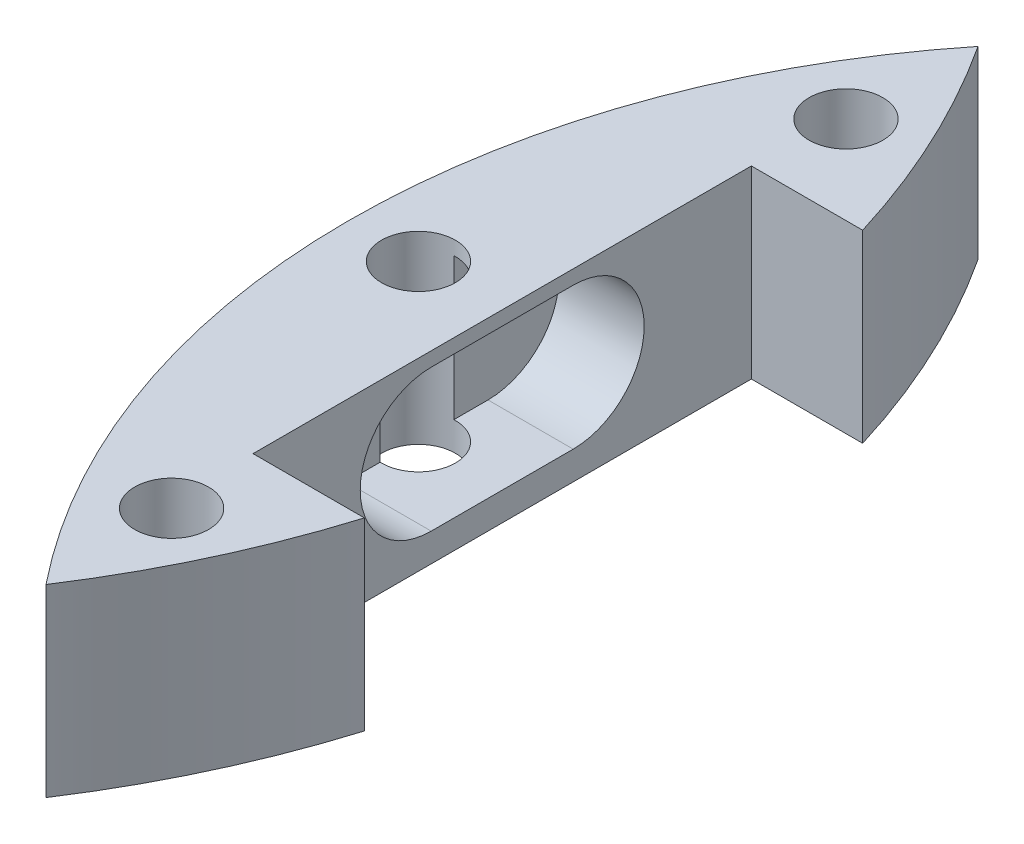
ISO-10303-21;
HEADER;
FILE_DESCRIPTION(('STEP AP214'),'2;1');
FILE_NAME('part.step','',(''),(''),'','','');
FILE_SCHEMA(('AUTOMOTIVE_DESIGN { 1 0 10303 214 1 1 1 1 }'));
ENDSEC;
DATA;
#1=APPLICATION_CONTEXT('core data for automotive mechanical design processes');
#2=APPLICATION_PROTOCOL_DEFINITION('international standard','automotive_design',2000,#1);
#3=PRODUCT_CONTEXT('',#1,'mechanical');
#4=PRODUCT('Part','Part','',(#3));
#5=PRODUCT_RELATED_PRODUCT_CATEGORY('part','',(#4));
#6=PRODUCT_DEFINITION_FORMATION('','',#4);
#7=PRODUCT_DEFINITION_CONTEXT('part definition',#1,'design');
#8=PRODUCT_DEFINITION('design','',#6,#7);
#9=PRODUCT_DEFINITION_SHAPE('','',#8);
#10=(LENGTH_UNIT() NAMED_UNIT(*) SI_UNIT(.MILLI.,.METRE.));
#11=(NAMED_UNIT(*) PLANE_ANGLE_UNIT() SI_UNIT($,.RADIAN.));
#12=(NAMED_UNIT(*) SI_UNIT($,.STERADIAN.) SOLID_ANGLE_UNIT());
#13=UNCERTAINTY_MEASURE_WITH_UNIT(LENGTH_MEASURE(1.E-05),#10,'distance_accuracy_value','');
#14=(GEOMETRIC_REPRESENTATION_CONTEXT(3) GLOBAL_UNCERTAINTY_ASSIGNED_CONTEXT((#13)) GLOBAL_UNIT_ASSIGNED_CONTEXT((#10,
#11,#12)) REPRESENTATION_CONTEXT('',''));
#15=CARTESIAN_POINT('',(0.,0.,0.));
#16=DIRECTION('',(0.,0.,1.));
#17=DIRECTION('',(1.,0.,0.));
#18=AXIS2_PLACEMENT_3D('',#15,#16,#17);
#19=CARTESIAN_POINT('',(-47.5,13.,0.));
#20=DIRECTION('',(0.,-1.,0.));
#21=DIRECTION('',(0.,0.,-1.));
#22=AXIS2_PLACEMENT_3D('',#19,#20,#21);
#23=CYLINDRICAL_SURFACE('',#22,2.6);
#24=CARTESIAN_POINT('',(-47.5,13.,0.));
#25=DIRECTION('',(0.,1.,0.));
#26=DIRECTION('',(0.,0.,1.));
#27=AXIS2_PLACEMENT_3D('',#24,#25,#26);
#28=CIRCLE('',#27,2.6);
#29=CARTESIAN_POINT('',(-47.5,13.,2.6));
#30=VERTEX_POINT('',#29);
#31=EDGE_CURVE('E195',#30,#30,#28,.T.);
#32=ORIENTED_EDGE('',*,*,#31,.T.);
#33=EDGE_LOOP('',(#32));
#34=FACE_BOUND('',#33,.T.);
#35=CARTESIAN_POINT('',(-47.5,0.,0.));
#36=DIRECTION('',(0.,1.,0.));
#37=DIRECTION('',(0.,0.,1.));
#38=AXIS2_PLACEMENT_3D('',#35,#36,#37);
#39=CIRCLE('',#38,2.6);
#40=CARTESIAN_POINT('',(-47.5,0.,2.6));
#41=VERTEX_POINT('',#40);
#42=EDGE_CURVE('E214',#41,#41,#39,.T.);
#43=ORIENTED_EDGE('',*,*,#42,.F.);
#44=EDGE_LOOP('',(#43));
#45=FACE_BOUND('',#44,.T.);
#46=CARTESIAN_POINT('',(-47.5,12.,0.));
#47=DIRECTION('',(0.,1.,0.));
#48=DIRECTION('',(0.,0.,1.));
#49=AXIS2_PLACEMENT_3D('',#46,#47,#48);
#50=CIRCLE('',#49,2.6);
#51=CARTESIAN_POINT('',(-47.6,12.,2.59807621135331));
#52=VERTEX_POINT('',#51);
#53=CARTESIAN_POINT('',(-47.6,12.,-2.59807621135331));
#54=VERTEX_POINT('',#53);
#55=EDGE_CURVE('E169',#52,#54,#50,.T.);
#56=ORIENTED_EDGE('',*,*,#55,.F.);
#57=DIRECTION('',(0.,-1.,0.));
#58=VECTOR('',#57,1.);
#59=CARTESIAN_POINT('',(-47.6,13.,2.59807621135331));
#60=LINE('',#59,#58);
#61=CARTESIAN_POINT('',(-47.6,2.,2.59807621135331));
#62=VERTEX_POINT('',#61);
#63=EDGE_CURVE('E11',#52,#62,#60,.T.);
#64=ORIENTED_EDGE('',*,*,#63,.T.);
#65=CARTESIAN_POINT('',(-47.5,2.,0.));
#66=DIRECTION('',(0.,-1.,0.));
#67=DIRECTION('',(0.,0.,-1.));
#68=AXIS2_PLACEMENT_3D('',#65,#66,#67);
#69=CIRCLE('',#68,2.6);
#70=CARTESIAN_POINT('',(-47.6,2.,-2.59807621135331));
#71=VERTEX_POINT('',#70);
#72=EDGE_CURVE('E141',#71,#62,#69,.T.);
#73=ORIENTED_EDGE('',*,*,#72,.F.);
#74=DIRECTION('',(0.,-1.,0.));
#75=VECTOR('',#74,1.);
#76=CARTESIAN_POINT('',(-47.6,13.,-2.59807621135331));
#77=LINE('',#76,#75);
#78=EDGE_CURVE('E46',#71,#54,#77,.F.);
#79=ORIENTED_EDGE('',*,*,#78,.T.);
#80=EDGE_LOOP('',(#56,#64,#73,#79));
#81=FACE_BOUND('',#80,.T.);
#82=ADVANCED_FACE('F38',(#34,#45,#81),#23,.F.);
#83=CARTESIAN_POINT('',(0.,13.,-17.55));
#84=DIRECTION('',(0.,0.,1.));
#85=DIRECTION('',(1.,0.,0.));
#86=AXIS2_PLACEMENT_3D('',#83,#84,#85);
#87=PLANE('',#86);
#88=DIRECTION('',(-1.,0.,0.));
#89=VECTOR('',#88,1.);
#90=CARTESIAN_POINT('',(0.,0.,-17.55));
#91=LINE('',#90,#89);
#92=CARTESIAN_POINT('',(-33.7602753147711,0.,-17.55));
#93=VERTEX_POINT('',#92);
#94=CARTESIAN_POINT('',(-41.6,0.,-17.55));
#95=VERTEX_POINT('',#94);
#96=EDGE_CURVE('E178',#93,#95,#91,.T.);
#97=ORIENTED_EDGE('',*,*,#96,.F.);
#98=DIRECTION('',(0.,-1.,0.));
#99=VECTOR('',#98,1.);
#100=CARTESIAN_POINT('',(-33.7602753147711,13.,-17.55));
#101=LINE('',#100,#99);
#102=CARTESIAN_POINT('',(-33.7602753147711,13.,-17.55));
#103=VERTEX_POINT('',#102);
#104=EDGE_CURVE('E227',#103,#93,#101,.T.);
#105=ORIENTED_EDGE('',*,*,#104,.F.);
#106=DIRECTION('',(-1.,0.,0.));
#107=VECTOR('',#106,1.);
#108=CARTESIAN_POINT('',(0.,13.,-17.55));
#109=LINE('',#108,#107);
#110=CARTESIAN_POINT('',(-41.6,13.,-17.55));
#111=VERTEX_POINT('',#110);
#112=EDGE_CURVE('E181',#103,#111,#109,.T.);
#113=ORIENTED_EDGE('',*,*,#112,.T.);
#114=DIRECTION('',(0.,1.,0.));
#115=VECTOR('',#114,1.);
#116=CARTESIAN_POINT('',(-41.6,-10.,-17.55));
#117=LINE('',#116,#115);
#118=EDGE_CURVE('E174',#95,#111,#117,.T.);
#119=ORIENTED_EDGE('',*,*,#118,.F.);
#120=EDGE_LOOP('',(#97,#105,#113,#119));
#121=FACE_BOUND('',#120,.T.);
#122=ADVANCED_FACE('F40',(#121),#87,.T.);
#123=CARTESIAN_POINT('',(-91.1362066797607,13.,-1.28369537222284E-13));
#124=DIRECTION('',(0.,-1.,0.));
#125=DIRECTION('',(0.,0.,-1.));
#126=AXIS2_PLACEMENT_3D('',#123,#124,#125);
#127=CYLINDRICAL_SURFACE('',#126,60.);
#128=CARTESIAN_POINT('',(-91.1362066797607,0.,-1.28369537222284E-13));
#129=DIRECTION('',(0.,1.,0.));
#130=DIRECTION('',(0.,0.,1.));
#131=AXIS2_PLACEMENT_3D('',#128,#129,#130);
#132=CIRCLE('',#131,60.);
#133=CARTESIAN_POINT('',(-40.9102536721667,0.,-32.8230657385773));
#134=VERTEX_POINT('',#133);
#135=EDGE_CURVE('E203',#93,#134,#132,.T.);
#136=ORIENTED_EDGE('',*,*,#135,.T.);
#137=DIRECTION('',(0.,-1.,0.));
#138=VECTOR('',#137,1.);
#139=CARTESIAN_POINT('',(-40.9102536721667,13.,-32.8230657385773));
#140=LINE('',#139,#138);
#141=CARTESIAN_POINT('',(-40.9102536721667,13.,-32.8230657385773));
#142=VERTEX_POINT('',#141);
#143=EDGE_CURVE('E224',#142,#134,#140,.T.);
#144=ORIENTED_EDGE('',*,*,#143,.F.);
#145=CARTESIAN_POINT('',(-91.1362066797607,13.,-1.28369537222284E-13));
#146=DIRECTION('',(0.,1.,0.));
#147=DIRECTION('',(0.,0.,1.));
#148=AXIS2_PLACEMENT_3D('',#145,#146,#147);
#149=CIRCLE('',#148,60.);
#150=EDGE_CURVE('E183',#103,#142,#149,.T.);
#151=ORIENTED_EDGE('',*,*,#150,.F.);
#152=ORIENTED_EDGE('',*,*,#104,.T.);
#153=EDGE_LOOP('',(#136,#144,#151,#152));
#154=FACE_BOUND('',#153,.T.);
#155=ADVANCED_FACE('F273',(#154),#127,.T.);
#156=CARTESIAN_POINT('',(0.,13.,0.));
#157=DIRECTION('',(0.,-1.,0.));
#158=DIRECTION('',(0.,0.,-1.));
#159=AXIS2_PLACEMENT_3D('',#156,#157,#158);
#160=CYLINDRICAL_SURFACE('',#159,52.45);
#161=CARTESIAN_POINT('',(0.,0.,0.));
#162=DIRECTION('',(0.,1.,0.));
#163=DIRECTION('',(0.,0.,1.));
#164=AXIS2_PLACEMENT_3D('',#161,#162,#163);
#165=CIRCLE('',#164,52.45);
#166=CARTESIAN_POINT('',(-40.9102536721668,0.,32.8230657385772));
#167=VERTEX_POINT('',#166);
#168=EDGE_CURVE('E205',#134,#167,#165,.T.);
#169=ORIENTED_EDGE('',*,*,#168,.T.);
#170=DIRECTION('',(0.,-1.,0.));
#171=VECTOR('',#170,1.);
#172=CARTESIAN_POINT('',(-40.9102536721668,13.,32.8230657385772));
#173=LINE('',#172,#171);
#174=CARTESIAN_POINT('',(-40.9102536721668,13.,32.8230657385772));
#175=VERTEX_POINT('',#174);
#176=EDGE_CURVE('E221',#175,#167,#173,.T.);
#177=ORIENTED_EDGE('',*,*,#176,.F.);
#178=CARTESIAN_POINT('',(0.,13.,0.));
#179=DIRECTION('',(0.,1.,0.));
#180=DIRECTION('',(0.,0.,1.));
#181=AXIS2_PLACEMENT_3D('',#178,#179,#180);
#182=CIRCLE('',#181,52.45);
#183=EDGE_CURVE('E186',#142,#175,#182,.T.);
#184=ORIENTED_EDGE('',*,*,#183,.F.);
#185=ORIENTED_EDGE('',*,*,#143,.T.);
#186=EDGE_LOOP('',(#169,#177,#184,#185));
#187=FACE_BOUND('',#186,.T.);
#188=ADVANCED_FACE('F277',(#187),#160,.T.);
#189=CARTESIAN_POINT('',(-91.1362066797607,13.,-1.28369537222284E-13));
#190=DIRECTION('',(0.,-1.,0.));
#191=DIRECTION('',(0.,0.,-1.));
#192=AXIS2_PLACEMENT_3D('',#189,#190,#191);
#193=CYLINDRICAL_SURFACE('',#192,60.);
#194=CARTESIAN_POINT('',(-91.1362066797607,0.,-1.28369537222284E-13));
#195=DIRECTION('',(0.,1.,0.));
#196=DIRECTION('',(0.,0.,1.));
#197=AXIS2_PLACEMENT_3D('',#194,#195,#196);
#198=CIRCLE('',#197,60.);
#199=CARTESIAN_POINT('',(-33.7602753147711,0.,17.55));
#200=VERTEX_POINT('',#199);
#201=EDGE_CURVE('E207',#167,#200,#198,.T.);
#202=ORIENTED_EDGE('',*,*,#201,.T.);
#203=DIRECTION('',(0.,-1.,0.));
#204=VECTOR('',#203,1.);
#205=CARTESIAN_POINT('',(-33.7602753147711,13.,17.55));
#206=LINE('',#205,#204);
#207=CARTESIAN_POINT('',(-33.7602753147711,13.,17.55));
#208=VERTEX_POINT('',#207);
#209=EDGE_CURVE('E201',#208,#200,#206,.T.);
#210=ORIENTED_EDGE('',*,*,#209,.F.);
#211=CARTESIAN_POINT('',(-91.1362066797607,13.,-1.28369537222284E-13));
#212=DIRECTION('',(0.,1.,0.));
#213=DIRECTION('',(0.,0.,1.));
#214=AXIS2_PLACEMENT_3D('',#211,#212,#213);
#215=CIRCLE('',#214,60.);
#216=EDGE_CURVE('E188',#175,#208,#215,.T.);
#217=ORIENTED_EDGE('',*,*,#216,.F.);
#218=ORIENTED_EDGE('',*,*,#176,.T.);
#219=EDGE_LOOP('',(#202,#210,#217,#218));
#220=FACE_BOUND('',#219,.T.);
#221=ADVANCED_FACE('F279',(#220),#193,.T.);
#222=CARTESIAN_POINT('',(0.,13.,17.55));
#223=DIRECTION('',(0.,0.,1.));
#224=DIRECTION('',(1.,0.,0.));
#225=AXIS2_PLACEMENT_3D('',#222,#223,#224);
#226=PLANE('',#225);
#227=DIRECTION('',(-1.,0.,0.));
#228=VECTOR('',#227,1.);
#229=CARTESIAN_POINT('',(0.,0.,17.55));
#230=LINE('',#229,#228);
#231=CARTESIAN_POINT('',(-41.6,0.,17.55));
#232=VERTEX_POINT('',#231);
#233=EDGE_CURVE('E209',#200,#232,#230,.T.);
#234=ORIENTED_EDGE('',*,*,#233,.T.);
#235=DIRECTION('',(0.,1.,0.));
#236=VECTOR('',#235,1.);
#237=CARTESIAN_POINT('',(-41.6,-10.,17.55));
#238=LINE('',#237,#236);
#239=CARTESIAN_POINT('',(-41.6,13.,17.55));
#240=VERTEX_POINT('',#239);
#241=EDGE_CURVE('E175',#232,#240,#238,.T.);
#242=ORIENTED_EDGE('',*,*,#241,.T.);
#243=DIRECTION('',(-1.,0.,0.));
#244=VECTOR('',#243,1.);
#245=CARTESIAN_POINT('',(0.,13.,17.55));
#246=LINE('',#245,#244);
#247=EDGE_CURVE('E190',#208,#240,#246,.T.);
#248=ORIENTED_EDGE('',*,*,#247,.F.);
#249=ORIENTED_EDGE('',*,*,#209,.T.);
#250=EDGE_LOOP('',(#234,#242,#248,#249));
#251=FACE_BOUND('',#250,.T.);
#252=ADVANCED_FACE('F263',(#251),#226,.F.);
#253=CARTESIAN_POINT('',(-41.1362066797607,13.,-23.7500000000003));
#254=DIRECTION('',(0.,-1.,0.));
#255=DIRECTION('',(0.,0.,-1.));
#256=AXIS2_PLACEMENT_3D('',#253,#254,#255);
#257=CYLINDRICAL_SURFACE('',#256,2.60000000000001);
#258=CARTESIAN_POINT('',(-41.1362066797607,13.,-23.7500000000003));
#259=DIRECTION('',(0.,1.,0.));
#260=DIRECTION('',(0.,0.,1.));
#261=AXIS2_PLACEMENT_3D('',#258,#259,#260);
#262=CIRCLE('',#261,2.60000000000001);
#263=CARTESIAN_POINT('',(-41.1362066797607,13.,-26.3500000000003));
#264=VERTEX_POINT('',#263);
#265=EDGE_CURVE('E192',#264,#264,#262,.T.);
#266=CARTESIAN_POINT('',(-41.1362066797607,0.,-23.7500000000003));
#267=DIRECTION('',(0.,1.,0.));
#268=DIRECTION('',(0.,0.,1.));
#269=AXIS2_PLACEMENT_3D('',#266,#267,#268);
#270=CIRCLE('',#269,2.60000000000001);
#271=CARTESIAN_POINT('',(-41.1362066797607,0.,-26.3500000000003));
#272=VERTEX_POINT('',#271);
#273=EDGE_CURVE('E211',#272,#272,#270,.T.);
#274=CARTESIAN_POINT('',(-41.1362066797607,13.,-26.3500000000003));
#275=CARTESIAN_POINT('',(-41.1362066797607,12.8645833333333,-26.3500000000003));
#276=CARTESIAN_POINT('',(-41.1362066797607,12.7291666666667,-26.3500000000003));
#277=CARTESIAN_POINT('',(-41.1362066797607,12.4583333333333,-26.3500000000003));
#278=CARTESIAN_POINT('',(-41.1362066797607,12.3229166666667,-26.3500000000003));
#279=CARTESIAN_POINT('',(-41.1362066797607,12.0520833333333,-26.3500000000003));
#280=CARTESIAN_POINT('',(-41.1362066797607,11.9166666666667,-26.3500000000003));
#281=CARTESIAN_POINT('',(-41.1362066797607,11.6458333333333,-26.3500000000003));
#282=CARTESIAN_POINT('',(-41.1362066797607,11.5104166666667,-26.3500000000003));
#283=CARTESIAN_POINT('',(-41.1362066797607,11.2395833333333,-26.3500000000003));
#284=CARTESIAN_POINT('',(-41.1362066797607,11.1041666666667,-26.3500000000003));
#285=CARTESIAN_POINT('',(-41.1362066797607,10.8333333333333,-26.3500000000003));
#286=CARTESIAN_POINT('',(-41.1362066797607,10.6979166666667,-26.3500000000003));
#287=CARTESIAN_POINT('',(-41.1362066797607,10.4270833333333,-26.3500000000003));
#288=CARTESIAN_POINT('',(-41.1362066797607,10.2916666666667,-26.3500000000003));
#289=CARTESIAN_POINT('',(-41.1362066797607,10.0208333333333,-26.3500000000003));
#290=CARTESIAN_POINT('',(-41.1362066797607,9.88541666666667,-26.3500000000003));
#291=CARTESIAN_POINT('',(-41.1362066797607,9.61458333333333,-26.3500000000003));
#292=CARTESIAN_POINT('',(-41.1362066797607,9.47916666666667,-26.3500000000003));
#293=CARTESIAN_POINT('',(-41.1362066797607,9.20833333333333,-26.3500000000003));
#294=CARTESIAN_POINT('',(-41.1362066797607,9.07291666666667,-26.3500000000003));
#295=CARTESIAN_POINT('',(-41.1362066797607,8.80208333333333,-26.3500000000003));
#296=CARTESIAN_POINT('',(-41.1362066797607,8.66666666666667,-26.3500000000003));
#297=CARTESIAN_POINT('',(-41.1362066797607,8.39583333333333,-26.3500000000003));
#298=CARTESIAN_POINT('',(-41.1362066797607,8.26041666666667,-26.3500000000003));
#299=CARTESIAN_POINT('',(-41.1362066797607,7.98958333333333,-26.3500000000003));
#300=CARTESIAN_POINT('',(-41.1362066797607,7.85416666666667,-26.3500000000003));
#301=CARTESIAN_POINT('',(-41.1362066797607,7.58333333333333,-26.3500000000003));
#302=CARTESIAN_POINT('',(-41.1362066797607,7.44791666666667,-26.3500000000003));
#303=CARTESIAN_POINT('',(-41.1362066797607,7.17708333333333,-26.3500000000003));
#304=CARTESIAN_POINT('',(-41.1362066797607,7.04166666666667,-26.3500000000003));
#305=CARTESIAN_POINT('',(-41.1362066797607,6.77083333333333,-26.3500000000003));
#306=CARTESIAN_POINT('',(-41.1362066797607,6.63541666666667,-26.3500000000003));
#307=CARTESIAN_POINT('',(-41.1362066797607,6.36458333333333,-26.3500000000003));
#308=CARTESIAN_POINT('',(-41.1362066797607,6.22916666666667,-26.3500000000003));
#309=CARTESIAN_POINT('',(-41.1362066797607,5.95833333333333,-26.3500000000003));
#310=CARTESIAN_POINT('',(-41.1362066797607,5.82291666666667,-26.3500000000003));
#311=CARTESIAN_POINT('',(-41.1362066797607,5.55208333333333,-26.3500000000003));
#312=CARTESIAN_POINT('',(-41.1362066797607,5.41666666666667,-26.3500000000003));
#313=CARTESIAN_POINT('',(-41.1362066797607,5.14583333333333,-26.3500000000003));
#314=CARTESIAN_POINT('',(-41.1362066797607,5.01041666666667,-26.3500000000003));
#315=CARTESIAN_POINT('',(-41.1362066797607,4.73958333333333,-26.3500000000003));
#316=CARTESIAN_POINT('',(-41.1362066797607,4.60416666666667,-26.3500000000003));
#317=CARTESIAN_POINT('',(-41.1362066797607,4.33333333333333,-26.3500000000003));
#318=CARTESIAN_POINT('',(-41.1362066797607,4.19791666666667,-26.3500000000003));
#319=CARTESIAN_POINT('',(-41.1362066797607,3.92708333333333,-26.3500000000003));
#320=CARTESIAN_POINT('',(-41.1362066797607,3.79166666666667,-26.3500000000003));
#321=CARTESIAN_POINT('',(-41.1362066797607,3.52083333333333,-26.3500000000003));
#322=CARTESIAN_POINT('',(-41.1362066797607,3.38541666666667,-26.3500000000003));
#323=CARTESIAN_POINT('',(-41.1362066797607,3.11458333333333,-26.3500000000003));
#324=CARTESIAN_POINT('',(-41.1362066797607,2.97916666666667,-26.3500000000003));
#325=CARTESIAN_POINT('',(-41.1362066797607,2.70833333333333,-26.3500000000003));
#326=CARTESIAN_POINT('',(-41.1362066797607,2.57291666666667,-26.3500000000003));
#327=CARTESIAN_POINT('',(-41.1362066797607,2.30208333333333,-26.3500000000003));
#328=CARTESIAN_POINT('',(-41.1362066797607,2.16666666666667,-26.3500000000003));
#329=CARTESIAN_POINT('',(-41.1362066797607,1.89583333333333,-26.3500000000003));
#330=CARTESIAN_POINT('',(-41.1362066797607,1.76041666666667,-26.3500000000003));
#331=CARTESIAN_POINT('',(-41.1362066797607,1.48958333333333,-26.3500000000003));
#332=CARTESIAN_POINT('',(-41.1362066797607,1.35416666666667,-26.3500000000003));
#333=CARTESIAN_POINT('',(-41.1362066797607,1.08333333333333,-26.3500000000003));
#334=CARTESIAN_POINT('',(-41.1362066797607,0.947916666666667,-26.3500000000003));
#335=CARTESIAN_POINT('',(-41.1362066797607,0.677083333333334,-26.3500000000003));
#336=CARTESIAN_POINT('',(-41.1362066797607,0.541666666666667,-26.3500000000003));
#337=CARTESIAN_POINT('',(-41.1362066797607,0.270833333333334,-26.3500000000003));
#338=CARTESIAN_POINT('',(-41.1362066797607,0.135416666666667,-26.3500000000003));
#339=CARTESIAN_POINT('',(-41.1362066797607,0.,-26.3500000000003));
#340=B_SPLINE_CURVE_WITH_KNOTS('',3,(#274,#275,#276,#277,#278,#279,#280,#281,#282,#283,#284,
#285,#286,#287,#288,#289,#290,#291,#292,#293,#294,#295,#296,#297,#298,#299,#300,#301,#302,#303,
#304,#305,#306,#307,#308,#309,#310,#311,#312,#313,#314,#315,#316,#317,#318,#319,#320,#321,#322,
#323,#324,#325,#326,#327,#328,#329,#330,#331,#332,#333,#334,#335,#336,#337,#338,#339),
.UNSPECIFIED.,.F.,.F.,(4,2,2,2,2,2,2,2,2,2,2,2,2,2,2,2,2,2,2,2,2,2,2,2,2,2,2,2,2,2,2,2,4),(0.,
0.406249999999999,0.812499999999999,1.21875,1.625,2.03125,2.4375,2.84375,3.25,3.65625,4.0625,
4.46875,4.875,5.28125,5.6875,6.09375,6.5,6.90625,7.3125,7.71875,8.125,8.53125,8.9375,9.34375,
9.75,10.15625,10.5625,10.96875,11.375,11.78125,12.1875,12.59375,13.),.UNSPECIFIED.);
#341=EDGE_CURVE('BSEAM287',#264,#272,#340,.T.);
#342=ORIENTED_EDGE('',*,*,#265,.T.);
#343=ORIENTED_EDGE('',*,*,#273,.F.);
#344=ORIENTED_EDGE('',*,*,#341,.T.);
#345=ORIENTED_EDGE('',*,*,#341,.F.);
#346=EDGE_LOOP('',(#342,#344,#343,#345));
#347=FACE_BOUND('',#346,.T.);
#348=ADVANCED_FACE('F287',(#347),#257,.F.);
#349=CARTESIAN_POINT('',(-41.1362066797608,13.,23.7500000000001));
#350=DIRECTION('',(0.,-1.,0.));
#351=DIRECTION('',(0.,0.,-1.));
#352=AXIS2_PLACEMENT_3D('',#349,#350,#351);
#353=CYLINDRICAL_SURFACE('',#352,2.59999999999999);
#354=CARTESIAN_POINT('',(-41.1362066797608,13.,23.7500000000001));
#355=DIRECTION('',(0.,1.,0.));
#356=DIRECTION('',(0.,0.,1.));
#357=AXIS2_PLACEMENT_3D('',#354,#355,#356);
#358=CIRCLE('',#357,2.59999999999999);
#359=CARTESIAN_POINT('',(-41.1362066797608,13.,21.1500000000001));
#360=VERTEX_POINT('',#359);
#361=EDGE_CURVE('E198',#360,#360,#358,.T.);
#362=CARTESIAN_POINT('',(-41.1362066797608,0.,23.7500000000001));
#363=DIRECTION('',(0.,1.,0.));
#364=DIRECTION('',(0.,0.,1.));
#365=AXIS2_PLACEMENT_3D('',#362,#363,#364);
#366=CIRCLE('',#365,2.59999999999999);
#367=CARTESIAN_POINT('',(-41.1362066797608,0.,21.1500000000001));
#368=VERTEX_POINT('',#367);
#369=EDGE_CURVE('E184',#368,#368,#366,.T.);
#370=CARTESIAN_POINT('',(-41.1362066797608,13.,21.1500000000001));
#371=CARTESIAN_POINT('',(-41.1362066797608,12.8645833333333,21.1500000000001));
#372=CARTESIAN_POINT('',(-41.1362066797608,12.7291666666667,21.1500000000001));
#373=CARTESIAN_POINT('',(-41.1362066797608,12.4583333333333,21.1500000000001));
#374=CARTESIAN_POINT('',(-41.1362066797608,12.3229166666667,21.1500000000001));
#375=CARTESIAN_POINT('',(-41.1362066797608,12.0520833333333,21.1500000000001));
#376=CARTESIAN_POINT('',(-41.1362066797608,11.9166666666667,21.1500000000001));
#377=CARTESIAN_POINT('',(-41.1362066797608,11.6458333333333,21.1500000000001));
#378=CARTESIAN_POINT('',(-41.1362066797608,11.5104166666667,21.1500000000001));
#379=CARTESIAN_POINT('',(-41.1362066797608,11.2395833333333,21.1500000000001));
#380=CARTESIAN_POINT('',(-41.1362066797608,11.1041666666667,21.1500000000001));
#381=CARTESIAN_POINT('',(-41.1362066797608,10.8333333333333,21.1500000000001));
#382=CARTESIAN_POINT('',(-41.1362066797608,10.6979166666667,21.1500000000001));
#383=CARTESIAN_POINT('',(-41.1362066797608,10.4270833333333,21.1500000000001));
#384=CARTESIAN_POINT('',(-41.1362066797608,10.2916666666667,21.1500000000001));
#385=CARTESIAN_POINT('',(-41.1362066797608,10.0208333333333,21.1500000000001));
#386=CARTESIAN_POINT('',(-41.1362066797608,9.88541666666667,21.1500000000001));
#387=CARTESIAN_POINT('',(-41.1362066797608,9.61458333333333,21.1500000000001));
#388=CARTESIAN_POINT('',(-41.1362066797608,9.47916666666667,21.1500000000001));
#389=CARTESIAN_POINT('',(-41.1362066797608,9.20833333333333,21.1500000000001));
#390=CARTESIAN_POINT('',(-41.1362066797608,9.07291666666667,21.1500000000001));
#391=CARTESIAN_POINT('',(-41.1362066797608,8.80208333333333,21.1500000000001));
#392=CARTESIAN_POINT('',(-41.1362066797608,8.66666666666667,21.1500000000001));
#393=CARTESIAN_POINT('',(-41.1362066797608,8.39583333333333,21.1500000000001));
#394=CARTESIAN_POINT('',(-41.1362066797608,8.26041666666667,21.1500000000001));
#395=CARTESIAN_POINT('',(-41.1362066797608,7.98958333333333,21.1500000000001));
#396=CARTESIAN_POINT('',(-41.1362066797608,7.85416666666667,21.1500000000001));
#397=CARTESIAN_POINT('',(-41.1362066797608,7.58333333333333,21.1500000000001));
#398=CARTESIAN_POINT('',(-41.1362066797608,7.44791666666667,21.1500000000001));
#399=CARTESIAN_POINT('',(-41.1362066797608,7.17708333333333,21.1500000000001));
#400=CARTESIAN_POINT('',(-41.1362066797608,7.04166666666667,21.1500000000001));
#401=CARTESIAN_POINT('',(-41.1362066797608,6.77083333333333,21.1500000000001));
#402=CARTESIAN_POINT('',(-41.1362066797608,6.63541666666667,21.1500000000001));
#403=CARTESIAN_POINT('',(-41.1362066797608,6.36458333333333,21.1500000000001));
#404=CARTESIAN_POINT('',(-41.1362066797608,6.22916666666667,21.1500000000001));
#405=CARTESIAN_POINT('',(-41.1362066797608,5.95833333333333,21.1500000000001));
#406=CARTESIAN_POINT('',(-41.1362066797608,5.82291666666667,21.1500000000001));
#407=CARTESIAN_POINT('',(-41.1362066797608,5.55208333333333,21.1500000000001));
#408=CARTESIAN_POINT('',(-41.1362066797608,5.41666666666667,21.1500000000001));
#409=CARTESIAN_POINT('',(-41.1362066797608,5.14583333333333,21.1500000000001));
#410=CARTESIAN_POINT('',(-41.1362066797608,5.01041666666667,21.1500000000001));
#411=CARTESIAN_POINT('',(-41.1362066797608,4.73958333333333,21.1500000000001));
#412=CARTESIAN_POINT('',(-41.1362066797608,4.60416666666667,21.1500000000001));
#413=CARTESIAN_POINT('',(-41.1362066797608,4.33333333333333,21.1500000000001));
#414=CARTESIAN_POINT('',(-41.1362066797608,4.19791666666667,21.1500000000001));
#415=CARTESIAN_POINT('',(-41.1362066797608,3.92708333333333,21.1500000000001));
#416=CARTESIAN_POINT('',(-41.1362066797608,3.79166666666667,21.1500000000001));
#417=CARTESIAN_POINT('',(-41.1362066797608,3.52083333333333,21.1500000000001));
#418=CARTESIAN_POINT('',(-41.1362066797608,3.38541666666667,21.1500000000001));
#419=CARTESIAN_POINT('',(-41.1362066797608,3.11458333333333,21.1500000000001));
#420=CARTESIAN_POINT('',(-41.1362066797608,2.97916666666667,21.1500000000001));
#421=CARTESIAN_POINT('',(-41.1362066797608,2.70833333333333,21.1500000000001));
#422=CARTESIAN_POINT('',(-41.1362066797608,2.57291666666667,21.1500000000001));
#423=CARTESIAN_POINT('',(-41.1362066797608,2.30208333333333,21.1500000000001));
#424=CARTESIAN_POINT('',(-41.1362066797608,2.16666666666667,21.1500000000001));
#425=CARTESIAN_POINT('',(-41.1362066797608,1.89583333333333,21.1500000000001));
#426=CARTESIAN_POINT('',(-41.1362066797608,1.76041666666667,21.1500000000001));
#427=CARTESIAN_POINT('',(-41.1362066797608,1.48958333333333,21.1500000000001));
#428=CARTESIAN_POINT('',(-41.1362066797608,1.35416666666667,21.1500000000001));
#429=CARTESIAN_POINT('',(-41.1362066797608,1.08333333333333,21.1500000000001));
#430=CARTESIAN_POINT('',(-41.1362066797608,0.947916666666667,21.1500000000001));
#431=CARTESIAN_POINT('',(-41.1362066797608,0.677083333333334,21.1500000000001));
#432=CARTESIAN_POINT('',(-41.1362066797608,0.541666666666667,21.1500000000001));
#433=CARTESIAN_POINT('',(-41.1362066797608,0.270833333333334,21.1500000000001));
#434=CARTESIAN_POINT('',(-41.1362066797608,0.135416666666667,21.1500000000001));
#435=CARTESIAN_POINT('',(-41.1362066797608,0.,21.1500000000001));
#436=B_SPLINE_CURVE_WITH_KNOTS('',3,(#370,#371,#372,#373,#374,#375,#376,#377,#378,#379,#380,
#381,#382,#383,#384,#385,#386,#387,#388,#389,#390,#391,#392,#393,#394,#395,#396,#397,#398,#399,
#400,#401,#402,#403,#404,#405,#406,#407,#408,#409,#410,#411,#412,#413,#414,#415,#416,#417,#418,
#419,#420,#421,#422,#423,#424,#425,#426,#427,#428,#429,#430,#431,#432,#433,#434,#435),
.UNSPECIFIED.,.F.,.F.,(4,2,2,2,2,2,2,2,2,2,2,2,2,2,2,2,2,2,2,2,2,2,2,2,2,2,2,2,2,2,2,2,4),(0.,
0.406249999999999,0.812499999999999,1.21875,1.625,2.03125,2.4375,2.84375,3.25,3.65625,4.0625,
4.46875,4.875,5.28125,5.6875,6.09375,6.5,6.90625,7.3125,7.71875,8.125,8.53125,8.9375,9.34375,
9.75,10.15625,10.5625,10.96875,11.375,11.78125,12.1875,12.59375,13.),.UNSPECIFIED.);
#437=EDGE_CURVE('BSEAM300',#360,#368,#436,.T.);
#438=ORIENTED_EDGE('',*,*,#361,.T.);
#439=ORIENTED_EDGE('',*,*,#369,.F.);
#440=ORIENTED_EDGE('',*,*,#437,.T.);
#441=ORIENTED_EDGE('',*,*,#437,.F.);
#442=EDGE_LOOP('',(#438,#440,#439,#441));
#443=FACE_BOUND('',#442,.T.);
#444=ADVANCED_FACE('F300',(#443),#353,.F.);
#445=CARTESIAN_POINT('',(0.,13.,0.));
#446=DIRECTION('',(0.,1.,0.));
#447=DIRECTION('',(0.,0.,1.));
#448=AXIS2_PLACEMENT_3D('',#445,#446,#447);
#449=PLANE('',#448);
#450=ORIENTED_EDGE('',*,*,#247,.T.);
#451=DIRECTION('',(0.,0.,1.));
#452=VECTOR('',#451,1.);
#453=CARTESIAN_POINT('',(-41.6,13.,-17.55));
#454=LINE('',#453,#452);
#455=EDGE_CURVE('E171',#111,#240,#454,.T.);
#456=ORIENTED_EDGE('',*,*,#455,.F.);
#457=ORIENTED_EDGE('',*,*,#112,.F.);
#458=ORIENTED_EDGE('',*,*,#150,.T.);
#459=ORIENTED_EDGE('',*,*,#183,.T.);
#460=ORIENTED_EDGE('',*,*,#216,.T.);
#461=EDGE_LOOP('',(#450,#456,#457,#458,#459,#460));
#462=FACE_BOUND('',#461,.T.);
#463=ORIENTED_EDGE('',*,*,#265,.F.);
#464=EDGE_LOOP('',(#463));
#465=FACE_BOUND('',#464,.T.);
#466=ORIENTED_EDGE('',*,*,#31,.F.);
#467=EDGE_LOOP('',(#466));
#468=FACE_BOUND('',#467,.T.);
#469=ORIENTED_EDGE('',*,*,#361,.F.);
#470=EDGE_LOOP('',(#469));
#471=FACE_BOUND('',#470,.T.);
#472=ADVANCED_FACE('F257',(#462,#465,#468,#471),#449,.T.);
#473=CARTESIAN_POINT('',(0.,0.,0.));
#474=DIRECTION('',(0.,1.,0.));
#475=DIRECTION('',(0.,0.,1.));
#476=AXIS2_PLACEMENT_3D('',#473,#474,#475);
#477=PLANE('',#476);
#478=DIRECTION('',(0.,0.,1.));
#479=VECTOR('',#478,1.);
#480=CARTESIAN_POINT('',(-41.6,0.,0.));
#481=LINE('',#480,#479);
#482=EDGE_CURVE('E229',#95,#232,#481,.T.);
#483=ORIENTED_EDGE('',*,*,#482,.T.);
#484=ORIENTED_EDGE('',*,*,#233,.F.);
#485=ORIENTED_EDGE('',*,*,#201,.F.);
#486=ORIENTED_EDGE('',*,*,#168,.F.);
#487=ORIENTED_EDGE('',*,*,#135,.F.);
#488=ORIENTED_EDGE('',*,*,#96,.T.);
#489=EDGE_LOOP('',(#483,#484,#485,#486,#487,#488));
#490=FACE_BOUND('',#489,.T.);
#491=ORIENTED_EDGE('',*,*,#273,.T.);
#492=EDGE_LOOP('',(#491));
#493=FACE_BOUND('',#492,.T.);
#494=ORIENTED_EDGE('',*,*,#42,.T.);
#495=EDGE_LOOP('',(#494));
#496=FACE_BOUND('',#495,.T.);
#497=ORIENTED_EDGE('',*,*,#369,.T.);
#498=EDGE_LOOP('',(#497));
#499=FACE_BOUND('',#498,.T.);
#500=ADVANCED_FACE('F247',(#490,#493,#496,#499),#477,.F.);
#501=CARTESIAN_POINT('',(-41.6,-10.,-17.55));
#502=DIRECTION('',(-1.,0.,0.));
#503=DIRECTION('',(0.,0.,1.));
#504=AXIS2_PLACEMENT_3D('',#501,#502,#503);
#505=PLANE('',#504);
#506=DIRECTION('',(0.,0.,-1.));
#507=VECTOR('',#506,1.);
#508=CARTESIAN_POINT('',(-41.6,2.,5.00000000000001));
#509=LINE('',#508,#507);
#510=CARTESIAN_POINT('',(-41.6,2.,5.00000000000001));
#511=VERTEX_POINT('',#510);
#512=CARTESIAN_POINT('',(-41.6,2.,-4.99999999999999));
#513=VERTEX_POINT('',#512);
#514=EDGE_CURVE('E159',#511,#513,#509,.T.);
#515=ORIENTED_EDGE('',*,*,#514,.F.);
#516=CARTESIAN_POINT('',(-41.6,7.,5.00000000000001));
#517=DIRECTION('',(1.,0.,0.));
#518=DIRECTION('',(0.,0.,-1.));
#519=AXIS2_PLACEMENT_3D('',#516,#517,#518);
#520=CIRCLE('',#519,5.);
#521=CARTESIAN_POINT('',(-41.6,12.,5.00000000000001));
#522=VERTEX_POINT('',#521);
#523=EDGE_CURVE('E61',#522,#511,#520,.T.);
#524=ORIENTED_EDGE('',*,*,#523,.F.);
#525=DIRECTION('',(0.,0.,1.));
#526=VECTOR('',#525,1.);
#527=CARTESIAN_POINT('',(-41.6,12.,5.00000000000001));
#528=LINE('',#527,#526);
#529=CARTESIAN_POINT('',(-41.6,12.,-4.99999999999999));
#530=VERTEX_POINT('',#529);
#531=EDGE_CURVE('E150',#530,#522,#528,.T.);
#532=ORIENTED_EDGE('',*,*,#531,.F.);
#533=CARTESIAN_POINT('',(-41.6,7.,-4.99999999999999));
#534=DIRECTION('',(1.,0.,0.));
#535=DIRECTION('',(0.,0.,-1.));
#536=AXIS2_PLACEMENT_3D('',#533,#534,#535);
#537=CIRCLE('',#536,5.);
#538=EDGE_CURVE('E153',#513,#530,#537,.T.);
#539=ORIENTED_EDGE('',*,*,#538,.F.);
#540=EDGE_LOOP('',(#515,#524,#532,#539));
#541=FACE_BOUND('',#540,.T.);
#542=ORIENTED_EDGE('',*,*,#118,.T.);
#543=ORIENTED_EDGE('',*,*,#455,.T.);
#544=ORIENTED_EDGE('',*,*,#241,.F.);
#545=ORIENTED_EDGE('',*,*,#482,.F.);
#546=EDGE_LOOP('',(#542,#543,#544,#545));
#547=FACE_BOUND('',#546,.T.);
#548=ADVANCED_FACE('F244',(#541,#547),#505,.F.);
#549=CARTESIAN_POINT('',(-47.6,7.,5.00000000000001));
#550=DIRECTION('',(1.,0.,0.));
#551=DIRECTION('',(0.,0.,-1.));
#552=AXIS2_PLACEMENT_3D('',#549,#550,#551);
#553=PLANE('',#552);
#554=DIRECTION('',(0.,0.,1.));
#555=VECTOR('',#554,1.);
#556=CARTESIAN_POINT('',(-47.6,12.,5.00000000000001));
#557=LINE('',#556,#555);
#558=CARTESIAN_POINT('',(-47.6,12.,5.00000000000001));
#559=VERTEX_POINT('',#558);
#560=EDGE_CURVE('E148',#52,#559,#557,.T.);
#561=ORIENTED_EDGE('',*,*,#560,.T.);
#562=CARTESIAN_POINT('',(-47.6,7.,5.00000000000001));
#563=DIRECTION('',(1.,0.,0.));
#564=DIRECTION('',(0.,0.,-1.));
#565=AXIS2_PLACEMENT_3D('',#562,#563,#564);
#566=CIRCLE('',#565,5.);
#567=CARTESIAN_POINT('',(-47.6,2.,5.00000000000001));
#568=VERTEX_POINT('',#567);
#569=EDGE_CURVE('E130',#559,#568,#566,.T.);
#570=ORIENTED_EDGE('',*,*,#569,.T.);
#571=DIRECTION('',(0.,0.,-1.));
#572=VECTOR('',#571,1.);
#573=CARTESIAN_POINT('',(-47.6,2.,5.00000000000001));
#574=LINE('',#573,#572);
#575=EDGE_CURVE('E137',#568,#62,#574,.T.);
#576=ORIENTED_EDGE('',*,*,#575,.T.);
#577=ORIENTED_EDGE('',*,*,#63,.F.);
#578=EDGE_LOOP('',(#561,#570,#576,#577));
#579=FACE_BOUND('',#578,.T.);
#580=ADVANCED_FACE('F146',(#579),#553,.T.);
#581=CARTESIAN_POINT('',(-47.6,7.,5.00000000000001));
#582=DIRECTION('',(1.,0.,0.));
#583=DIRECTION('',(0.,0.,-1.));
#584=AXIS2_PLACEMENT_3D('',#581,#582,#583);
#585=CYLINDRICAL_SURFACE('',#584,5.);
#586=ORIENTED_EDGE('',*,*,#523,.T.);
#587=DIRECTION('',(1.,0.,0.));
#588=VECTOR('',#587,1.);
#589=CARTESIAN_POINT('',(-47.6,2.,5.00000000000001));
#590=LINE('',#589,#588);
#591=EDGE_CURVE('E126',#568,#511,#590,.T.);
#592=ORIENTED_EDGE('',*,*,#591,.F.);
#593=ORIENTED_EDGE('',*,*,#569,.F.);
#594=DIRECTION('',(1.,0.,0.));
#595=VECTOR('',#594,1.);
#596=CARTESIAN_POINT('',(-47.6,12.,5.00000000000001));
#597=LINE('',#596,#595);
#598=EDGE_CURVE('E163',#559,#522,#597,.T.);
#599=ORIENTED_EDGE('',*,*,#598,.T.);
#600=EDGE_LOOP('',(#586,#592,#593,#599));
#601=FACE_BOUND('',#600,.T.);
#602=ADVANCED_FACE('F128',(#601),#585,.F.);
#603=CARTESIAN_POINT('',(-47.6,12.,5.00000000000001));
#604=DIRECTION('',(0.,1.,0.));
#605=DIRECTION('',(0.,0.,1.));
#606=AXIS2_PLACEMENT_3D('',#603,#604,#605);
#607=PLANE('',#606);
#608=ORIENTED_EDGE('',*,*,#55,.T.);
#609=CARTESIAN_POINT('',(-47.6,12.,-4.99999999999999));
#610=VERTEX_POINT('',#609);
#611=EDGE_CURVE('E53',#610,#54,#557,.T.);
#612=ORIENTED_EDGE('',*,*,#611,.F.);
#613=DIRECTION('',(1.,0.,0.));
#614=VECTOR('',#613,1.);
#615=CARTESIAN_POINT('',(-47.6,12.,-4.99999999999999));
#616=LINE('',#615,#614);
#617=EDGE_CURVE('E165',#610,#530,#616,.T.);
#618=ORIENTED_EDGE('',*,*,#617,.T.);
#619=ORIENTED_EDGE('',*,*,#531,.T.);
#620=ORIENTED_EDGE('',*,*,#598,.F.);
#621=ORIENTED_EDGE('',*,*,#560,.F.);
#622=EDGE_LOOP('',(#608,#612,#618,#619,#620,#621));
#623=FACE_BOUND('',#622,.T.);
#624=ADVANCED_FACE('F241',(#623),#607,.F.);
#625=CARTESIAN_POINT('',(-47.6,7.,-4.99999999999999));
#626=DIRECTION('',(1.,0.,0.));
#627=DIRECTION('',(0.,0.,-1.));
#628=AXIS2_PLACEMENT_3D('',#625,#626,#627);
#629=CYLINDRICAL_SURFACE('',#628,5.);
#630=ORIENTED_EDGE('',*,*,#538,.T.);
#631=ORIENTED_EDGE('',*,*,#617,.F.);
#632=CARTESIAN_POINT('',(-47.6,7.,-4.99999999999999));
#633=DIRECTION('',(1.,0.,0.));
#634=DIRECTION('',(0.,0.,-1.));
#635=AXIS2_PLACEMENT_3D('',#632,#633,#634);
#636=CIRCLE('',#635,5.);
#637=CARTESIAN_POINT('',(-47.6,2.,-4.99999999999999));
#638=VERTEX_POINT('',#637);
#639=EDGE_CURVE('E143',#638,#610,#636,.T.);
#640=ORIENTED_EDGE('',*,*,#639,.F.);
#641=DIRECTION('',(1.,0.,0.));
#642=VECTOR('',#641,1.);
#643=CARTESIAN_POINT('',(-47.6,2.,-4.99999999999999));
#644=LINE('',#643,#642);
#645=EDGE_CURVE('E134',#638,#513,#644,.T.);
#646=ORIENTED_EDGE('',*,*,#645,.T.);
#647=EDGE_LOOP('',(#630,#631,#640,#646));
#648=FACE_BOUND('',#647,.T.);
#649=ADVANCED_FACE('F239',(#648),#629,.F.);
#650=CARTESIAN_POINT('',(-47.6,2.,5.00000000000001));
#651=DIRECTION('',(0.,-1.,0.));
#652=DIRECTION('',(0.,0.,-1.));
#653=AXIS2_PLACEMENT_3D('',#650,#651,#652);
#654=PLANE('',#653);
#655=ORIENTED_EDGE('',*,*,#72,.T.);
#656=ORIENTED_EDGE('',*,*,#575,.F.);
#657=ORIENTED_EDGE('',*,*,#591,.T.);
#658=ORIENTED_EDGE('',*,*,#514,.T.);
#659=ORIENTED_EDGE('',*,*,#645,.F.);
#660=EDGE_CURVE('E144',#71,#638,#574,.T.);
#661=ORIENTED_EDGE('',*,*,#660,.F.);
#662=EDGE_LOOP('',(#655,#656,#657,#658,#659,#661));
#663=FACE_BOUND('',#662,.T.);
#664=ADVANCED_FACE('F138',(#663),#654,.F.);
#665=ORIENTED_EDGE('',*,*,#660,.T.);
#666=ORIENTED_EDGE('',*,*,#639,.T.);
#667=ORIENTED_EDGE('',*,*,#611,.T.);
#668=ORIENTED_EDGE('',*,*,#78,.F.);
#669=EDGE_LOOP('',(#665,#666,#667,#668));
#670=FACE_BOUND('',#669,.T.);
#671=ADVANCED_FACE('F234',(#670),#553,.T.);
#672=CLOSED_SHELL('',(#82,#122,#155,#188,#221,#252,#348,#444,#472,#500,#548,#580,#602,#624,#649,
#664,#671));
#673=MANIFOLD_SOLID_BREP('B2',#672);
#674=ADVANCED_BREP_SHAPE_REPRESENTATION('',(#18,#673),#14);
#675=SHAPE_DEFINITION_REPRESENTATION(#9,#674);
ENDSEC;
END-ISO-10303-21;
